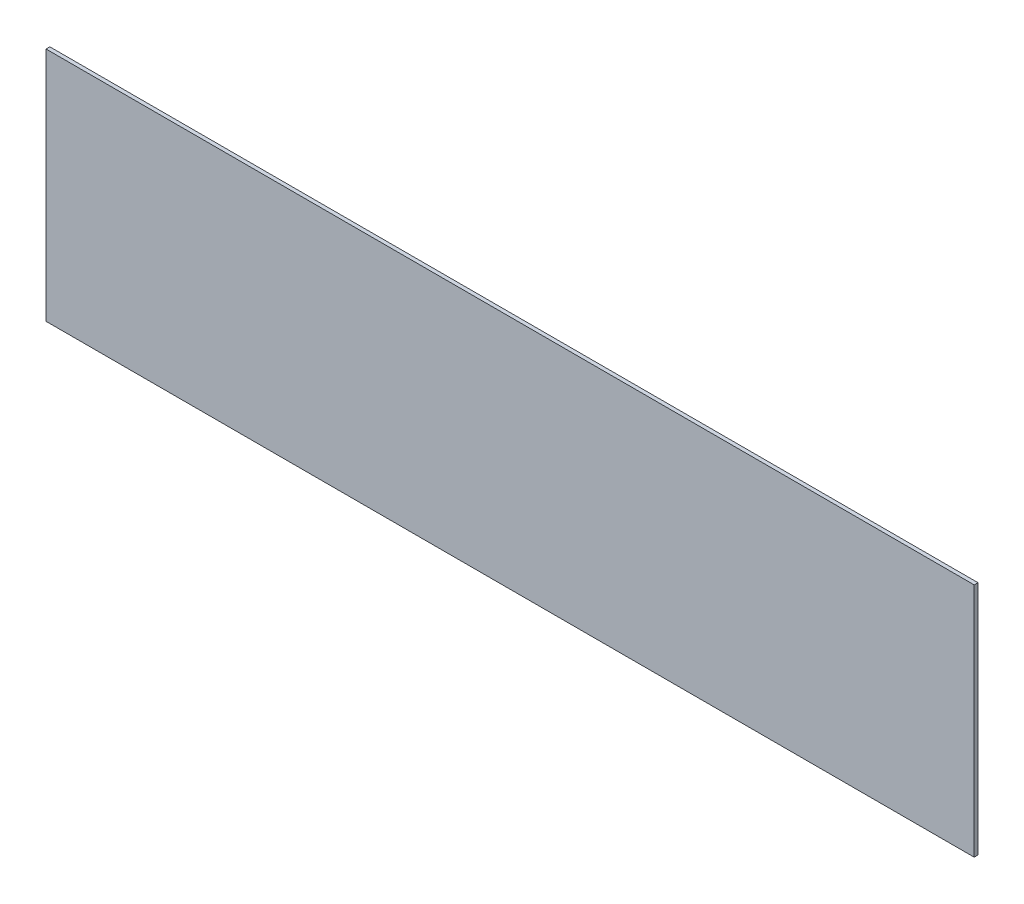
ISO-10303-21;
HEADER;
FILE_DESCRIPTION(('STEP AP214'),'2;1');
FILE_NAME('part.step','',(''),(''),'','','');
FILE_SCHEMA(('AUTOMOTIVE_DESIGN { 1 0 10303 214 1 1 1 1 }'));
ENDSEC;
DATA;
#1=APPLICATION_CONTEXT('core data for automotive mechanical design processes');
#2=APPLICATION_PROTOCOL_DEFINITION('international standard','automotive_design',2000,#1);
#3=PRODUCT_CONTEXT('',#1,'mechanical');
#4=PRODUCT('Part','Part','',(#3));
#5=PRODUCT_RELATED_PRODUCT_CATEGORY('part','',(#4));
#6=PRODUCT_DEFINITION_FORMATION('','',#4);
#7=PRODUCT_DEFINITION_CONTEXT('part definition',#1,'design');
#8=PRODUCT_DEFINITION('design','',#6,#7);
#9=PRODUCT_DEFINITION_SHAPE('','',#8);
#10=(LENGTH_UNIT() NAMED_UNIT(*) SI_UNIT(.MILLI.,.METRE.));
#11=(NAMED_UNIT(*) PLANE_ANGLE_UNIT() SI_UNIT($,.RADIAN.));
#12=(NAMED_UNIT(*) SI_UNIT($,.STERADIAN.) SOLID_ANGLE_UNIT());
#13=UNCERTAINTY_MEASURE_WITH_UNIT(LENGTH_MEASURE(1.E-05),#10,'distance_accuracy_value','');
#14=(GEOMETRIC_REPRESENTATION_CONTEXT(3) GLOBAL_UNCERTAINTY_ASSIGNED_CONTEXT((#13)) GLOBAL_UNIT_ASSIGNED_CONTEXT((#10,
#11,#12)) REPRESENTATION_CONTEXT('',''));
#15=CARTESIAN_POINT('',(0.,0.,0.));
#16=DIRECTION('',(0.,0.,1.));
#17=DIRECTION('',(1.,0.,0.));
#18=AXIS2_PLACEMENT_3D('',#15,#16,#17);
#19=CARTESIAN_POINT('',(0.,0.,10.));
#20=DIRECTION('',(1.,0.,0.));
#21=DIRECTION('',(0.,0.,-1.));
#22=AXIS2_PLACEMENT_3D('',#19,#20,#21);
#23=PLANE('',#22);
#24=DIRECTION('',(0.,-1.,0.));
#25=VECTOR('',#24,1.);
#26=CARTESIAN_POINT('',(0.,0.,0.));
#27=LINE('',#26,#25);
#28=CARTESIAN_POINT('',(0.,620.,0.));
#29=VERTEX_POINT('',#28);
#30=CARTESIAN_POINT('',(0.,0.,0.));
#31=VERTEX_POINT('',#30);
#32=EDGE_CURVE('E98',#29,#31,#27,.T.);
#33=ORIENTED_EDGE('',*,*,#32,.T.);
#34=DIRECTION('',(0.,0.,-1.));
#35=VECTOR('',#34,1.);
#36=CARTESIAN_POINT('',(0.,0.,10.));
#37=LINE('',#36,#35);
#38=CARTESIAN_POINT('',(0.,0.,10.));
#39=VERTEX_POINT('',#38);
#40=EDGE_CURVE('E11',#39,#31,#37,.T.);
#41=ORIENTED_EDGE('',*,*,#40,.F.);
#42=DIRECTION('',(0.,-1.,0.));
#43=VECTOR('',#42,1.);
#44=CARTESIAN_POINT('',(0.,0.,10.));
#45=LINE('',#44,#43);
#46=CARTESIAN_POINT('',(0.,620.,10.));
#47=VERTEX_POINT('',#46);
#48=EDGE_CURVE('E86',#47,#39,#45,.T.);
#49=ORIENTED_EDGE('',*,*,#48,.F.);
#50=DIRECTION('',(0.,0.,-1.));
#51=VECTOR('',#50,1.);
#52=CARTESIAN_POINT('',(0.,620.,10.));
#53=LINE('',#52,#51);
#54=EDGE_CURVE('E94',#47,#29,#53,.T.);
#55=ORIENTED_EDGE('',*,*,#54,.T.);
#56=EDGE_LOOP('',(#33,#41,#49,#55));
#57=FACE_BOUND('',#56,.T.);
#58=ADVANCED_FACE('F35',(#57),#23,.F.);
#59=CARTESIAN_POINT('',(0.,0.,10.));
#60=DIRECTION('',(0.,1.,0.));
#61=DIRECTION('',(0.,0.,1.));
#62=AXIS2_PLACEMENT_3D('',#59,#60,#61);
#63=PLANE('',#62);
#64=DIRECTION('',(1.,0.,0.));
#65=VECTOR('',#64,1.);
#66=CARTESIAN_POINT('',(0.,0.,0.));
#67=LINE('',#66,#65);
#68=CARTESIAN_POINT('',(2440.,0.,0.));
#69=VERTEX_POINT('',#68);
#70=EDGE_CURVE('E90',#31,#69,#67,.T.);
#71=ORIENTED_EDGE('',*,*,#70,.T.);
#72=DIRECTION('',(0.,0.,-1.));
#73=VECTOR('',#72,1.);
#74=CARTESIAN_POINT('',(2440.,0.,10.));
#75=LINE('',#74,#73);
#76=CARTESIAN_POINT('',(2440.,0.,10.));
#77=VERTEX_POINT('',#76);
#78=EDGE_CURVE('E43',#77,#69,#75,.T.);
#79=ORIENTED_EDGE('',*,*,#78,.F.);
#80=DIRECTION('',(1.,0.,0.));
#81=VECTOR('',#80,1.);
#82=CARTESIAN_POINT('',(0.,0.,10.));
#83=LINE('',#82,#81);
#84=EDGE_CURVE('E81',#39,#77,#83,.T.);
#85=ORIENTED_EDGE('',*,*,#84,.F.);
#86=ORIENTED_EDGE('',*,*,#40,.T.);
#87=EDGE_LOOP('',(#71,#79,#85,#86));
#88=FACE_BOUND('',#87,.T.);
#89=ADVANCED_FACE('F89',(#88),#63,.F.);
#90=CARTESIAN_POINT('',(2440.,0.,10.));
#91=DIRECTION('',(-1.,0.,0.));
#92=DIRECTION('',(0.,0.,1.));
#93=AXIS2_PLACEMENT_3D('',#90,#91,#92);
#94=PLANE('',#93);
#95=DIRECTION('',(0.,1.,0.));
#96=VECTOR('',#95,1.);
#97=CARTESIAN_POINT('',(2440.,0.,0.));
#98=LINE('',#97,#96);
#99=CARTESIAN_POINT('',(2440.,620.,0.));
#100=VERTEX_POINT('',#99);
#101=EDGE_CURVE('E68',#69,#100,#98,.T.);
#102=ORIENTED_EDGE('',*,*,#101,.T.);
#103=DIRECTION('',(0.,0.,-1.));
#104=VECTOR('',#103,1.);
#105=CARTESIAN_POINT('',(2440.,620.,10.));
#106=LINE('',#105,#104);
#107=CARTESIAN_POINT('',(2440.,620.,10.));
#108=VERTEX_POINT('',#107);
#109=EDGE_CURVE('E91',#108,#100,#106,.T.);
#110=ORIENTED_EDGE('',*,*,#109,.F.);
#111=DIRECTION('',(0.,1.,0.));
#112=VECTOR('',#111,1.);
#113=CARTESIAN_POINT('',(2440.,0.,10.));
#114=LINE('',#113,#112);
#115=EDGE_CURVE('E84',#77,#108,#114,.T.);
#116=ORIENTED_EDGE('',*,*,#115,.F.);
#117=ORIENTED_EDGE('',*,*,#78,.T.);
#118=EDGE_LOOP('',(#102,#110,#116,#117));
#119=FACE_BOUND('',#118,.T.);
#120=ADVANCED_FACE('F92',(#119),#94,.F.);
#121=CARTESIAN_POINT('',(0.,620.,10.));
#122=DIRECTION('',(0.,-1.,0.));
#123=DIRECTION('',(1.,0.,0.));
#124=AXIS2_PLACEMENT_3D('',#121,#122,#123);
#125=PLANE('',#124);
#126=DIRECTION('',(-1.,0.,0.));
#127=VECTOR('',#126,1.);
#128=CARTESIAN_POINT('',(0.,620.,0.));
#129=LINE('',#128,#127);
#130=EDGE_CURVE('E74',#100,#29,#129,.T.);
#131=ORIENTED_EDGE('',*,*,#130,.T.);
#132=ORIENTED_EDGE('',*,*,#54,.F.);
#133=DIRECTION('',(-1.,0.,0.));
#134=VECTOR('',#133,1.);
#135=CARTESIAN_POINT('',(0.,620.,10.));
#136=LINE('',#135,#134);
#137=EDGE_CURVE('E51',#108,#47,#136,.T.);
#138=ORIENTED_EDGE('',*,*,#137,.F.);
#139=ORIENTED_EDGE('',*,*,#109,.T.);
#140=EDGE_LOOP('',(#131,#132,#138,#139));
#141=FACE_BOUND('',#140,.T.);
#142=ADVANCED_FACE('F105',(#141),#125,.F.);
#143=CARTESIAN_POINT('',(0.,0.,10.));
#144=DIRECTION('',(0.,0.,-1.));
#145=DIRECTION('',(-1.,0.,0.));
#146=AXIS2_PLACEMENT_3D('',#143,#144,#145);
#147=PLANE('',#146);
#148=ORIENTED_EDGE('',*,*,#48,.T.);
#149=ORIENTED_EDGE('',*,*,#84,.T.);
#150=ORIENTED_EDGE('',*,*,#115,.T.);
#151=ORIENTED_EDGE('',*,*,#137,.T.);
#152=EDGE_LOOP('',(#148,#149,#150,#151));
#153=FACE_BOUND('',#152,.T.);
#154=ADVANCED_FACE('F82',(#153),#147,.F.);
#155=CARTESIAN_POINT('',(0.,0.,0.));
#156=DIRECTION('',(0.,0.,-1.));
#157=DIRECTION('',(-1.,0.,0.));
#158=AXIS2_PLACEMENT_3D('',#155,#156,#157);
#159=PLANE('',#158);
#160=ORIENTED_EDGE('',*,*,#32,.F.);
#161=ORIENTED_EDGE('',*,*,#130,.F.);
#162=ORIENTED_EDGE('',*,*,#101,.F.);
#163=ORIENTED_EDGE('',*,*,#70,.F.);
#164=EDGE_LOOP('',(#160,#161,#162,#163));
#165=FACE_BOUND('',#164,.T.);
#166=ADVANCED_FACE('F108',(#165),#159,.T.);
#167=CLOSED_SHELL('',(#58,#89,#120,#142,#154,#166));
#168=MANIFOLD_SOLID_BREP('B2',#167);
#169=ADVANCED_BREP_SHAPE_REPRESENTATION('',(#18,#168),#14);
#170=SHAPE_DEFINITION_REPRESENTATION(#9,#169);
ENDSEC;
END-ISO-10303-21;
